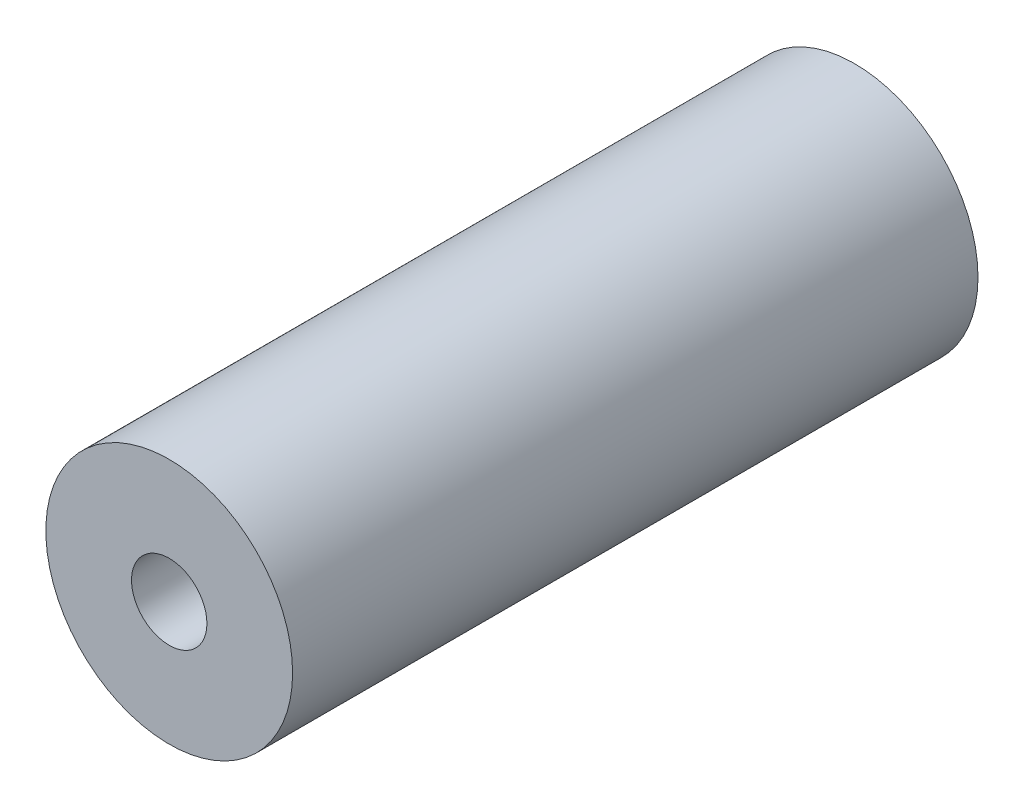
ISO-10303-21;
HEADER;
FILE_DESCRIPTION(('STEP AP214'),'2;1');
FILE_NAME('part.step','',(''),(''),'','','');
FILE_SCHEMA(('AUTOMOTIVE_DESIGN { 1 0 10303 214 1 1 1 1 }'));
ENDSEC;
DATA;
#1=APPLICATION_CONTEXT('core data for automotive mechanical design processes');
#2=APPLICATION_PROTOCOL_DEFINITION('international standard','automotive_design',2000,#1);
#3=PRODUCT_CONTEXT('',#1,'mechanical');
#4=PRODUCT('Part','Part','',(#3));
#5=PRODUCT_RELATED_PRODUCT_CATEGORY('part','',(#4));
#6=PRODUCT_DEFINITION_FORMATION('','',#4);
#7=PRODUCT_DEFINITION_CONTEXT('part definition',#1,'design');
#8=PRODUCT_DEFINITION('design','',#6,#7);
#9=PRODUCT_DEFINITION_SHAPE('','',#8);
#10=(LENGTH_UNIT() NAMED_UNIT(*) SI_UNIT(.MILLI.,.METRE.));
#11=(NAMED_UNIT(*) PLANE_ANGLE_UNIT() SI_UNIT($,.RADIAN.));
#12=(NAMED_UNIT(*) SI_UNIT($,.STERADIAN.) SOLID_ANGLE_UNIT());
#13=UNCERTAINTY_MEASURE_WITH_UNIT(LENGTH_MEASURE(1.E-05),#10,'distance_accuracy_value','');
#14=(GEOMETRIC_REPRESENTATION_CONTEXT(3) GLOBAL_UNCERTAINTY_ASSIGNED_CONTEXT((#13)) GLOBAL_UNIT_ASSIGNED_CONTEXT((#10,
#11,#12)) REPRESENTATION_CONTEXT('',''));
#15=CARTESIAN_POINT('',(0.,0.,0.));
#16=DIRECTION('',(0.,0.,1.));
#17=DIRECTION('',(1.,0.,0.));
#18=AXIS2_PLACEMENT_3D('',#15,#16,#17);
#19=CARTESIAN_POINT('',(49.356053326821,-35.92102448427,-7.));
#20=DIRECTION('',(0.,0.,1.));
#21=DIRECTION('',(1.,0.,0.));
#22=AXIS2_PLACEMENT_3D('',#19,#20,#21);
#23=PLANE('',#22);
#24=CARTESIAN_POINT('',(49.356053326821,-35.92102448427,-7.));
#25=DIRECTION('',(0.,0.,1.));
#26=DIRECTION('',(1.,0.,0.));
#27=AXIS2_PLACEMENT_3D('',#24,#25,#26);
#28=CIRCLE('',#27,1.1);
#29=CARTESIAN_POINT('',(50.456053326821,-35.92102448427,-7.));
#30=VERTEX_POINT('',#29);
#31=EDGE_CURVE('E23',#30,#30,#28,.T.);
#32=ORIENTED_EDGE('',*,*,#31,.F.);
#33=EDGE_LOOP('',(#32));
#34=FACE_BOUND('',#33,.T.);
#35=CARTESIAN_POINT('',(49.356053326821,-35.92102448427,-7.));
#36=DIRECTION('',(0.,0.,1.));
#37=DIRECTION('',(1.,0.,0.));
#38=AXIS2_PLACEMENT_3D('',#35,#36,#37);
#39=CIRCLE('',#38,3.6);
#40=CARTESIAN_POINT('',(52.956053326821,-35.92102448427,-7.));
#41=VERTEX_POINT('',#40);
#42=EDGE_CURVE('E57',#41,#41,#39,.T.);
#43=ORIENTED_EDGE('',*,*,#42,.T.);
#44=EDGE_LOOP('',(#43));
#45=FACE_BOUND('',#44,.T.);
#46=ADVANCED_FACE('F15',(#34,#45),#23,.T.);
#47=CARTESIAN_POINT('',(49.356053326821,-35.92102448427,-27.));
#48=DIRECTION('',(0.,0.,1.));
#49=DIRECTION('',(1.,0.,0.));
#50=AXIS2_PLACEMENT_3D('',#47,#48,#49);
#51=PLANE('',#50);
#52=CARTESIAN_POINT('',(49.356053326821,-35.92102448427,-27.));
#53=DIRECTION('',(0.,0.,1.));
#54=DIRECTION('',(1.,0.,0.));
#55=AXIS2_PLACEMENT_3D('',#52,#53,#54);
#56=CIRCLE('',#55,1.1);
#57=CARTESIAN_POINT('',(50.456053326821,-35.92102448427,-27.));
#58=VERTEX_POINT('',#57);
#59=EDGE_CURVE('E9',#58,#58,#56,.T.);
#60=ORIENTED_EDGE('',*,*,#59,.T.);
#61=EDGE_LOOP('',(#60));
#62=FACE_BOUND('',#61,.T.);
#63=CARTESIAN_POINT('',(49.356053326821,-35.92102448427,-27.));
#64=DIRECTION('',(0.,0.,1.));
#65=DIRECTION('',(1.,0.,0.));
#66=AXIS2_PLACEMENT_3D('',#63,#64,#65);
#67=CIRCLE('',#66,3.6);
#68=CARTESIAN_POINT('',(52.956053326821,-35.92102448427,-27.));
#69=VERTEX_POINT('',#68);
#70=EDGE_CURVE('E54',#69,#69,#67,.T.);
#71=ORIENTED_EDGE('',*,*,#70,.F.);
#72=EDGE_LOOP('',(#71));
#73=FACE_BOUND('',#72,.T.);
#74=ADVANCED_FACE('F76',(#62,#73),#51,.F.);
#75=CARTESIAN_POINT('',(49.356053326821,-35.92102448427,-27.));
#76=DIRECTION('',(0.,0.,-1.));
#77=DIRECTION('',(1.,0.,0.));
#78=AXIS2_PLACEMENT_3D('',#75,#76,#77);
#79=CYLINDRICAL_SURFACE('',#78,1.1);
#80=DIRECTION('',(0.,0.,1.));
#81=VECTOR('',#80,1.);
#82=CARTESIAN_POINT('',(50.456053326821,-35.92102448427,-27.));
#83=LINE('',#82,#81);
#84=EDGE_CURVE('E62',#58,#30,#83,.T.);
#85=ORIENTED_EDGE('',*,*,#84,.T.);
#86=ORIENTED_EDGE('',*,*,#31,.T.);
#87=ORIENTED_EDGE('',*,*,#84,.F.);
#88=ORIENTED_EDGE('',*,*,#59,.F.);
#89=EDGE_LOOP('',(#85,#86,#87,#88));
#90=FACE_BOUND('',#89,.T.);
#91=ADVANCED_FACE('F72',(#90),#79,.F.);
#92=CARTESIAN_POINT('',(49.356053326821,-35.92102448427,-27.));
#93=DIRECTION('',(0.,0.,-1.));
#94=DIRECTION('',(1.,0.,0.));
#95=AXIS2_PLACEMENT_3D('',#92,#93,#94);
#96=CYLINDRICAL_SURFACE('',#95,3.6);
#97=ORIENTED_EDGE('',*,*,#70,.T.);
#98=DIRECTION('',(0.,0.,1.));
#99=VECTOR('',#98,1.);
#100=CARTESIAN_POINT('',(52.956053326821,-35.92102448427,-27.));
#101=LINE('',#100,#99);
#102=EDGE_CURVE('E55',#69,#41,#101,.T.);
#103=ORIENTED_EDGE('',*,*,#102,.T.);
#104=ORIENTED_EDGE('',*,*,#42,.F.);
#105=ORIENTED_EDGE('',*,*,#102,.F.);
#106=EDGE_LOOP('',(#97,#103,#104,#105));
#107=FACE_BOUND('',#106,.T.);
#108=ADVANCED_FACE('F52',(#107),#96,.T.);
#109=CLOSED_SHELL('',(#46,#74,#91,#108));
#110=MANIFOLD_SOLID_BREP('B1',#109);
#111=ADVANCED_BREP_SHAPE_REPRESENTATION('',(#18,#110),#14);
#112=SHAPE_DEFINITION_REPRESENTATION(#9,#111);
ENDSEC;
END-ISO-10303-21;
